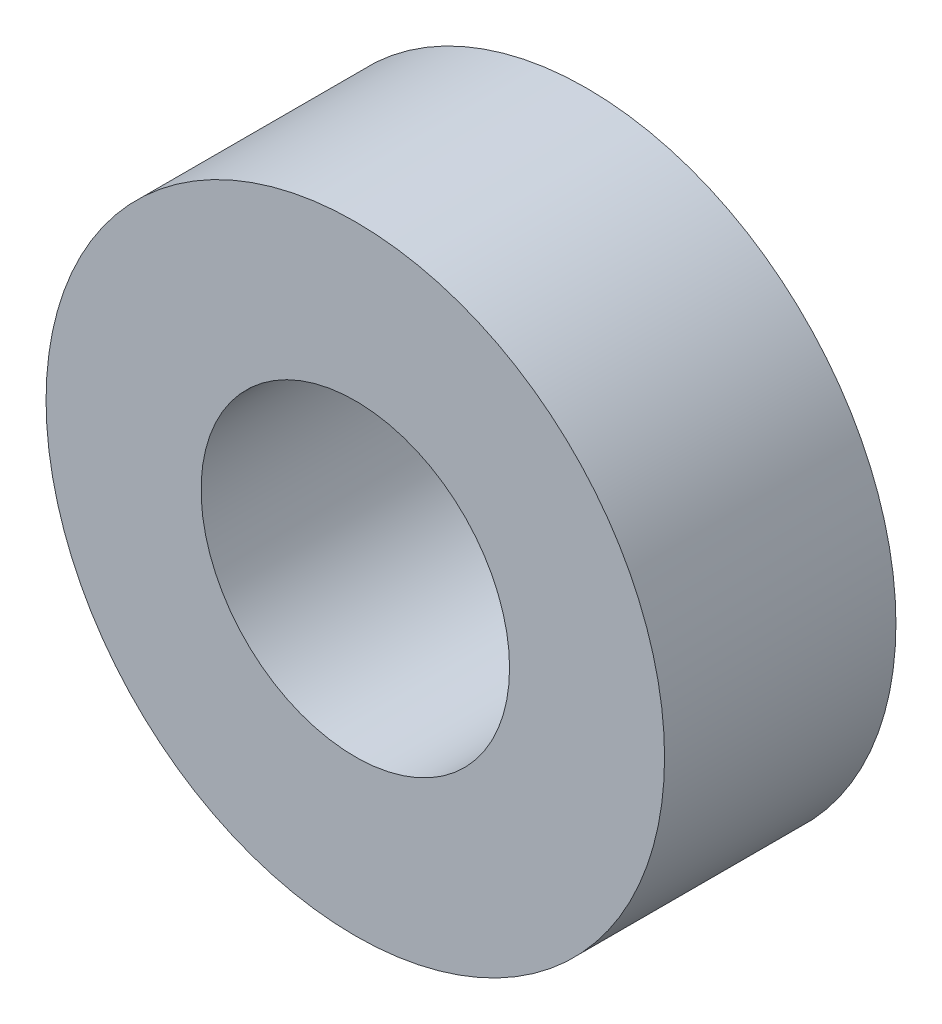
ISO-10303-21;
HEADER;
FILE_DESCRIPTION(('STEP AP214'),'2;1');
FILE_NAME('part.step','',(''),(''),'','','');
FILE_SCHEMA(('AUTOMOTIVE_DESIGN { 1 0 10303 214 1 1 1 1 }'));
ENDSEC;
DATA;
#1=APPLICATION_CONTEXT('core data for automotive mechanical design processes');
#2=APPLICATION_PROTOCOL_DEFINITION('international standard','automotive_design',2000,#1);
#3=PRODUCT_CONTEXT('',#1,'mechanical');
#4=PRODUCT('Part','Part','',(#3));
#5=PRODUCT_RELATED_PRODUCT_CATEGORY('part','',(#4));
#6=PRODUCT_DEFINITION_FORMATION('','',#4);
#7=PRODUCT_DEFINITION_CONTEXT('part definition',#1,'design');
#8=PRODUCT_DEFINITION('design','',#6,#7);
#9=PRODUCT_DEFINITION_SHAPE('','',#8);
#10=(LENGTH_UNIT() NAMED_UNIT(*) SI_UNIT(.MILLI.,.METRE.));
#11=(NAMED_UNIT(*) PLANE_ANGLE_UNIT() SI_UNIT($,.RADIAN.));
#12=(NAMED_UNIT(*) SI_UNIT($,.STERADIAN.) SOLID_ANGLE_UNIT());
#13=UNCERTAINTY_MEASURE_WITH_UNIT(LENGTH_MEASURE(1.E-05),#10,'distance_accuracy_value','');
#14=(GEOMETRIC_REPRESENTATION_CONTEXT(3) GLOBAL_UNCERTAINTY_ASSIGNED_CONTEXT((#13)) GLOBAL_UNIT_ASSIGNED_CONTEXT((#10,
#11,#12)) REPRESENTATION_CONTEXT('',''));
#15=CARTESIAN_POINT('',(0.,0.,0.));
#16=DIRECTION('',(0.,0.,1.));
#17=DIRECTION('',(1.,0.,0.));
#18=AXIS2_PLACEMENT_3D('',#15,#16,#17);
#19=CARTESIAN_POINT('',(0.,0.,1.5));
#20=DIRECTION('',(0.,0.,1.));
#21=DIRECTION('',(1.,0.,0.));
#22=AXIS2_PLACEMENT_3D('',#19,#20,#21);
#23=PLANE('',#22);
#24=CARTESIAN_POINT('',(0.,0.,1.5));
#25=DIRECTION('',(0.,0.,1.));
#26=DIRECTION('',(1.,0.,0.));
#27=AXIS2_PLACEMENT_3D('',#24,#25,#26);
#28=CIRCLE('',#27,4.01);
#29=CARTESIAN_POINT('',(4.01,0.,1.5));
#30=VERTEX_POINT('',#29);
#31=EDGE_CURVE('E10',#30,#30,#28,.T.);
#32=ORIENTED_EDGE('',*,*,#31,.T.);
#33=EDGE_LOOP('',(#32));
#34=FACE_BOUND('',#33,.T.);
#35=CARTESIAN_POINT('',(0.,0.,1.5));
#36=DIRECTION('',(0.,0.,1.));
#37=DIRECTION('',(1.,0.,0.));
#38=AXIS2_PLACEMENT_3D('',#35,#36,#37);
#39=CIRCLE('',#38,2.);
#40=CARTESIAN_POINT('',(2.,0.,1.5));
#41=VERTEX_POINT('',#40);
#42=EDGE_CURVE('E39',#41,#41,#39,.T.);
#43=ORIENTED_EDGE('',*,*,#42,.F.);
#44=EDGE_LOOP('',(#43));
#45=FACE_BOUND('',#44,.T.);
#46=ADVANCED_FACE('F28',(#34,#45),#23,.T.);
#47=CARTESIAN_POINT('',(0.,0.,-1.5));
#48=DIRECTION('',(0.,0.,1.));
#49=DIRECTION('',(1.,0.,0.));
#50=AXIS2_PLACEMENT_3D('',#47,#48,#49);
#51=PLANE('',#50);
#52=CARTESIAN_POINT('',(0.,0.,-1.5));
#53=DIRECTION('',(0.,0.,1.));
#54=DIRECTION('',(1.,0.,0.));
#55=AXIS2_PLACEMENT_3D('',#52,#53,#54);
#56=CIRCLE('',#55,4.01);
#57=CARTESIAN_POINT('',(4.01,0.,-1.5));
#58=VERTEX_POINT('',#57);
#59=EDGE_CURVE('E32',#58,#58,#56,.T.);
#60=ORIENTED_EDGE('',*,*,#59,.F.);
#61=EDGE_LOOP('',(#60));
#62=FACE_BOUND('',#61,.T.);
#63=CARTESIAN_POINT('',(0.,0.,-1.5));
#64=DIRECTION('',(0.,0.,1.));
#65=DIRECTION('',(1.,0.,0.));
#66=AXIS2_PLACEMENT_3D('',#63,#64,#65);
#67=CIRCLE('',#66,2.);
#68=CARTESIAN_POINT('',(2.,0.,-1.5));
#69=VERTEX_POINT('',#68);
#70=EDGE_CURVE('E41',#69,#69,#67,.T.);
#71=ORIENTED_EDGE('',*,*,#70,.T.);
#72=EDGE_LOOP('',(#71));
#73=FACE_BOUND('',#72,.T.);
#74=ADVANCED_FACE('F51',(#62,#73),#51,.F.);
#75=CARTESIAN_POINT('',(0.,0.,1.5));
#76=DIRECTION('',(0.,0.,-1.));
#77=DIRECTION('',(-1.,0.,0.));
#78=AXIS2_PLACEMENT_3D('',#75,#76,#77);
#79=CYLINDRICAL_SURFACE('',#78,4.01);
#80=ORIENTED_EDGE('',*,*,#31,.F.);
#81=EDGE_LOOP('',(#80));
#82=FACE_BOUND('',#81,.T.);
#83=ORIENTED_EDGE('',*,*,#59,.T.);
#84=EDGE_LOOP('',(#83));
#85=FACE_BOUND('',#84,.T.);
#86=ADVANCED_FACE('F30',(#82,#85),#79,.T.);
#87=CARTESIAN_POINT('',(0.,0.,1.5));
#88=DIRECTION('',(0.,0.,-1.));
#89=DIRECTION('',(-1.,0.,0.));
#90=AXIS2_PLACEMENT_3D('',#87,#88,#89);
#91=CYLINDRICAL_SURFACE('',#90,2.);
#92=ORIENTED_EDGE('',*,*,#42,.T.);
#93=EDGE_LOOP('',(#92));
#94=FACE_BOUND('',#93,.T.);
#95=ORIENTED_EDGE('',*,*,#70,.F.);
#96=EDGE_LOOP('',(#95));
#97=FACE_BOUND('',#96,.T.);
#98=ADVANCED_FACE('F47',(#94,#97),#91,.F.);
#99=CLOSED_SHELL('',(#46,#74,#86,#98));
#100=MANIFOLD_SOLID_BREP('B2',#99);
#101=ADVANCED_BREP_SHAPE_REPRESENTATION('',(#18,#100),#14);
#102=SHAPE_DEFINITION_REPRESENTATION(#9,#101);
ENDSEC;
END-ISO-10303-21;
